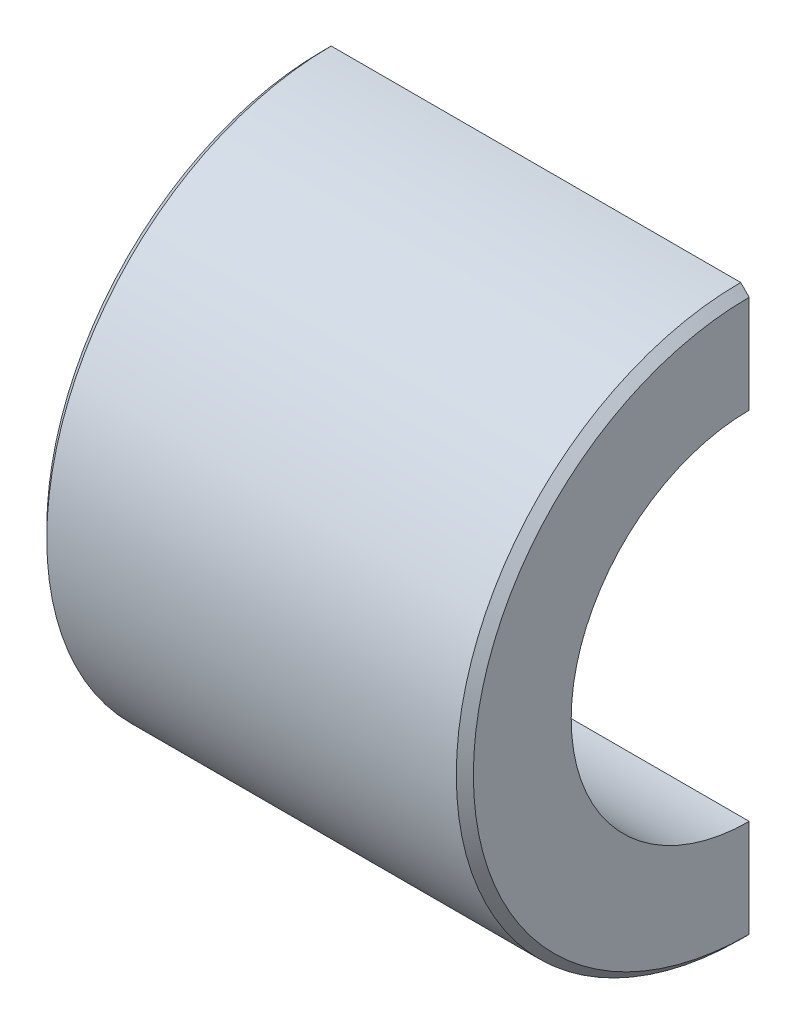
ISO-10303-21;
HEADER;
FILE_DESCRIPTION(('STEP AP214'),'2;1');
FILE_NAME('part.step','',(''),(''),'','','');
FILE_SCHEMA(('AUTOMOTIVE_DESIGN { 1 0 10303 214 1 1 1 1 }'));
ENDSEC;
DATA;
#1=APPLICATION_CONTEXT('core data for automotive mechanical design processes');
#2=APPLICATION_PROTOCOL_DEFINITION('international standard','automotive_design',2000,#1);
#3=PRODUCT_CONTEXT('',#1,'mechanical');
#4=PRODUCT('Part','Part','',(#3));
#5=PRODUCT_RELATED_PRODUCT_CATEGORY('part','',(#4));
#6=PRODUCT_DEFINITION_FORMATION('','',#4);
#7=PRODUCT_DEFINITION_CONTEXT('part definition',#1,'design');
#8=PRODUCT_DEFINITION('design','',#6,#7);
#9=PRODUCT_DEFINITION_SHAPE('','',#8);
#10=(LENGTH_UNIT() NAMED_UNIT(*) SI_UNIT(.MILLI.,.METRE.));
#11=(NAMED_UNIT(*) PLANE_ANGLE_UNIT() SI_UNIT($,.RADIAN.));
#12=(NAMED_UNIT(*) SI_UNIT($,.STERADIAN.) SOLID_ANGLE_UNIT());
#13=UNCERTAINTY_MEASURE_WITH_UNIT(LENGTH_MEASURE(1.E-05),#10,'distance_accuracy_value','');
#14=(GEOMETRIC_REPRESENTATION_CONTEXT(3) GLOBAL_UNCERTAINTY_ASSIGNED_CONTEXT((#13)) GLOBAL_UNIT_ASSIGNED_CONTEXT((#10,
#11,#12)) REPRESENTATION_CONTEXT('',''));
#15=CARTESIAN_POINT('',(0.,0.,0.));
#16=DIRECTION('',(0.,0.,1.));
#17=DIRECTION('',(1.,0.,0.));
#18=AXIS2_PLACEMENT_3D('',#15,#16,#17);
#19=CARTESIAN_POINT('',(19.05,-7.9502,0.));
#20=DIRECTION('',(-1.,0.,0.));
#21=DIRECTION('',(0.,0.,1.));
#22=AXIS2_PLACEMENT_3D('',#19,#20,#21);
#23=PLANE('',#22);
#24=DIRECTION('',(0.,1.,0.));
#25=VECTOR('',#24,1.);
#26=CARTESIAN_POINT('',(19.05,7.9502,0.));
#27=LINE('',#26,#25);
#28=CARTESIAN_POINT('',(19.05,7.9502,0.));
#29=VERTEX_POINT('',#28);
#30=CARTESIAN_POINT('',(19.05,12.319,0.));
#31=VERTEX_POINT('',#30);
#32=EDGE_CURVE('E114',#29,#31,#27,.T.);
#33=ORIENTED_EDGE('',*,*,#32,.T.);
#34=CARTESIAN_POINT('',(19.05,0.,0.));
#35=DIRECTION('',(-1.,0.,0.));
#36=DIRECTION('',(0.,0.,1.));
#37=AXIS2_PLACEMENT_3D('',#34,#35,#36);
#38=CIRCLE('',#37,12.319);
#39=CARTESIAN_POINT('',(19.05,-12.319,0.));
#40=VERTEX_POINT('',#39);
#41=EDGE_CURVE('E11',#31,#40,#38,.F.);
#42=ORIENTED_EDGE('',*,*,#41,.T.);
#43=DIRECTION('',(0.,-1.,0.));
#44=VECTOR('',#43,1.);
#45=CARTESIAN_POINT('',(19.05,-7.9502,0.));
#46=LINE('',#45,#44);
#47=CARTESIAN_POINT('',(19.05,-7.9502,0.));
#48=VERTEX_POINT('',#47);
#49=EDGE_CURVE('E115',#48,#40,#46,.T.);
#50=ORIENTED_EDGE('',*,*,#49,.F.);
#51=CARTESIAN_POINT('',(19.05,0.,0.));
#52=DIRECTION('',(-1.,0.,0.));
#53=DIRECTION('',(0.,0.,1.));
#54=AXIS2_PLACEMENT_3D('',#51,#52,#53);
#55=CIRCLE('',#54,7.9502);
#56=EDGE_CURVE('E111',#48,#29,#55,.T.);
#57=ORIENTED_EDGE('',*,*,#56,.T.);
#58=EDGE_LOOP('',(#33,#42,#50,#57));
#59=FACE_BOUND('',#58,.T.);
#60=ADVANCED_FACE('F36',(#59),#23,.F.);
#61=CARTESIAN_POINT('',(0.,0.,0.));
#62=DIRECTION('',(-1.,0.,0.));
#63=DIRECTION('',(0.,0.,1.));
#64=AXIS2_PLACEMENT_3D('',#61,#62,#63);
#65=CYLINDRICAL_SURFACE('',#64,7.9502);
#66=CARTESIAN_POINT('',(0.,0.,0.));
#67=DIRECTION('',(-1.,0.,0.));
#68=DIRECTION('',(0.,0.,1.));
#69=AXIS2_PLACEMENT_3D('',#66,#67,#68);
#70=CIRCLE('',#69,7.9502);
#71=CARTESIAN_POINT('',(0.,-7.9502,0.));
#72=VERTEX_POINT('',#71);
#73=CARTESIAN_POINT('',(0.,7.9502,0.));
#74=VERTEX_POINT('',#73);
#75=EDGE_CURVE('E96',#72,#74,#70,.T.);
#76=ORIENTED_EDGE('',*,*,#75,.T.);
#77=DIRECTION('',(1.,0.,0.));
#78=VECTOR('',#77,1.);
#79=CARTESIAN_POINT('',(0.,7.9502,0.));
#80=LINE('',#79,#78);
#81=EDGE_CURVE('E102',#74,#29,#80,.T.);
#82=ORIENTED_EDGE('',*,*,#81,.T.);
#83=ORIENTED_EDGE('',*,*,#56,.F.);
#84=DIRECTION('',(1.,0.,0.));
#85=VECTOR('',#84,1.);
#86=CARTESIAN_POINT('',(0.,-7.9502,0.));
#87=LINE('',#86,#85);
#88=EDGE_CURVE('E110',#72,#48,#87,.T.);
#89=ORIENTED_EDGE('',*,*,#88,.F.);
#90=EDGE_LOOP('',(#76,#82,#83,#89));
#91=FACE_BOUND('',#90,.T.);
#92=ADVANCED_FACE('F107',(#91),#65,.F.);
#93=CARTESIAN_POINT('',(0.,-7.9502,0.));
#94=DIRECTION('',(1.,0.,0.));
#95=DIRECTION('',(0.,0.,-1.));
#96=AXIS2_PLACEMENT_3D('',#93,#94,#95);
#97=PLANE('',#96);
#98=DIRECTION('',(0.,1.,0.));
#99=VECTOR('',#98,1.);
#100=CARTESIAN_POINT('',(0.,-7.9502,0.));
#101=LINE('',#100,#99);
#102=CARTESIAN_POINT('',(0.,-12.319,0.));
#103=VERTEX_POINT('',#102);
#104=EDGE_CURVE('E122',#103,#72,#101,.T.);
#105=ORIENTED_EDGE('',*,*,#104,.F.);
#106=CARTESIAN_POINT('',(0.,0.,0.));
#107=DIRECTION('',(1.,0.,0.));
#108=DIRECTION('',(0.,0.,-1.));
#109=AXIS2_PLACEMENT_3D('',#106,#107,#108);
#110=CIRCLE('',#109,12.319);
#111=CARTESIAN_POINT('',(0.,12.319,0.));
#112=VERTEX_POINT('',#111);
#113=EDGE_CURVE('E99',#103,#112,#110,.F.);
#114=ORIENTED_EDGE('',*,*,#113,.T.);
#115=DIRECTION('',(0.,-1.,0.));
#116=VECTOR('',#115,1.);
#117=CARTESIAN_POINT('',(0.,7.9502,0.));
#118=LINE('',#117,#116);
#119=EDGE_CURVE('E92',#112,#74,#118,.T.);
#120=ORIENTED_EDGE('',*,*,#119,.T.);
#121=ORIENTED_EDGE('',*,*,#75,.F.);
#122=EDGE_LOOP('',(#105,#114,#120,#121));
#123=FACE_BOUND('',#122,.T.);
#124=ADVANCED_FACE('F95',(#123),#97,.F.);
#125=CARTESIAN_POINT('',(0.,0.,0.));
#126=DIRECTION('',(-1.,0.,0.));
#127=DIRECTION('',(0.,0.,1.));
#128=AXIS2_PLACEMENT_3D('',#125,#126,#127);
#129=CYLINDRICAL_SURFACE('',#128,12.7);
#130=DIRECTION('',(-1.,0.,0.));
#131=VECTOR('',#130,1.);
#132=CARTESIAN_POINT('',(0.,12.7,0.));
#133=LINE('',#132,#131);
#134=CARTESIAN_POINT('',(18.669,12.7,0.));
#135=VERTEX_POINT('',#134);
#136=CARTESIAN_POINT('',(0.380999999999998,12.7,0.));
#137=VERTEX_POINT('',#136);
#138=EDGE_CURVE('E103',#135,#137,#133,.T.);
#139=ORIENTED_EDGE('',*,*,#138,.T.);
#140=CARTESIAN_POINT('',(0.380999999999998,0.,0.));
#141=DIRECTION('',(1.,0.,0.));
#142=DIRECTION('',(0.,0.,-1.));
#143=AXIS2_PLACEMENT_3D('',#140,#141,#142);
#144=CIRCLE('',#143,12.7);
#145=CARTESIAN_POINT('',(0.380999999999998,-12.7,0.));
#146=VERTEX_POINT('',#145);
#147=EDGE_CURVE('E57',#137,#146,#144,.T.);
#148=ORIENTED_EDGE('',*,*,#147,.T.);
#149=DIRECTION('',(-1.,0.,0.));
#150=VECTOR('',#149,1.);
#151=CARTESIAN_POINT('',(0.,-12.7,0.));
#152=LINE('',#151,#150);
#153=CARTESIAN_POINT('',(18.669,-12.7,0.));
#154=VERTEX_POINT('',#153);
#155=EDGE_CURVE('E117',#154,#146,#152,.T.);
#156=ORIENTED_EDGE('',*,*,#155,.F.);
#157=CARTESIAN_POINT('',(18.669,0.,0.));
#158=DIRECTION('',(-1.,0.,0.));
#159=DIRECTION('',(0.,0.,1.));
#160=AXIS2_PLACEMENT_3D('',#157,#158,#159);
#161=CIRCLE('',#160,12.7);
#162=EDGE_CURVE('E131',#154,#135,#161,.T.);
#163=ORIENTED_EDGE('',*,*,#162,.T.);
#164=EDGE_LOOP('',(#139,#148,#156,#163));
#165=FACE_BOUND('',#164,.T.);
#166=ADVANCED_FACE('F142',(#165),#129,.T.);
#167=CARTESIAN_POINT('',(0.,0.,0.));
#168=DIRECTION('',(0.,0.,1.));
#169=DIRECTION('',(-1.,0.,0.));
#170=AXIS2_PLACEMENT_3D('',#167,#168,#169);
#171=PLANE('',#170);
#172=ORIENTED_EDGE('',*,*,#155,.T.);
#173=DIRECTION('',(0.707106781186549,-0.707106781186546,0.));
#174=VECTOR('',#173,1.);
#175=CARTESIAN_POINT('',(-12.3190000000001,0.,0.));
#176=LINE('',#175,#174);
#177=EDGE_CURVE('E44',#146,#103,#176,.F.);
#178=ORIENTED_EDGE('',*,*,#177,.T.);
#179=ORIENTED_EDGE('',*,*,#104,.T.);
#180=ORIENTED_EDGE('',*,*,#88,.T.);
#181=ORIENTED_EDGE('',*,*,#49,.T.);
#182=DIRECTION('',(0.707106781186552,0.707106781186543,0.));
#183=VECTOR('',#182,1.);
#184=CARTESIAN_POINT('',(31.3690000000002,0.,0.));
#185=LINE('',#184,#183);
#186=EDGE_CURVE('E135',#40,#154,#185,.F.);
#187=ORIENTED_EDGE('',*,*,#186,.T.);
#188=EDGE_LOOP('',(#172,#178,#179,#180,#181,#187));
#189=FACE_BOUND('',#188,.T.);
#190=ADVANCED_FACE('F138',(#189),#171,.F.);
#191=CARTESIAN_POINT('',(0.,0.,0.));
#192=DIRECTION('',(0.,0.,-1.));
#193=DIRECTION('',(-1.,0.,0.));
#194=AXIS2_PLACEMENT_3D('',#191,#192,#193);
#195=PLANE('',#194);
#196=ORIENTED_EDGE('',*,*,#119,.F.);
#197=DIRECTION('',(0.707106781186549,0.707106781186546,0.));
#198=VECTOR('',#197,1.);
#199=CARTESIAN_POINT('',(-12.3190000000001,0.,0.));
#200=LINE('',#199,#198);
#201=EDGE_CURVE('E129',#112,#137,#200,.T.);
#202=ORIENTED_EDGE('',*,*,#201,.T.);
#203=ORIENTED_EDGE('',*,*,#138,.F.);
#204=DIRECTION('',(0.707106781186552,-0.707106781186543,0.));
#205=VECTOR('',#204,1.);
#206=CARTESIAN_POINT('',(31.3690000000002,0.,0.));
#207=LINE('',#206,#205);
#208=EDGE_CURVE('E127',#135,#31,#207,.T.);
#209=ORIENTED_EDGE('',*,*,#208,.T.);
#210=ORIENTED_EDGE('',*,*,#32,.F.);
#211=ORIENTED_EDGE('',*,*,#81,.F.);
#212=EDGE_LOOP('',(#196,#202,#203,#209,#210,#211));
#213=FACE_BOUND('',#212,.T.);
#214=ADVANCED_FACE('F113',(#213),#195,.T.);
#215=CARTESIAN_POINT('',(0.,0.,0.));
#216=DIRECTION('',(1.,0.,0.));
#217=DIRECTION('',(0.,0.,-1.));
#218=AXIS2_PLACEMENT_3D('',#215,#216,#217);
#219=CONICAL_SURFACE('',#218,12.319,0.785398163397446);
#220=ORIENTED_EDGE('',*,*,#177,.F.);
#221=ORIENTED_EDGE('',*,*,#147,.F.);
#222=ORIENTED_EDGE('',*,*,#201,.F.);
#223=ORIENTED_EDGE('',*,*,#113,.F.);
#224=EDGE_LOOP('',(#220,#221,#222,#223));
#225=FACE_BOUND('',#224,.T.);
#226=ADVANCED_FACE('F140',(#225),#219,.T.);
#227=CARTESIAN_POINT('',(18.669,0.,0.));
#228=DIRECTION('',(-1.,0.,0.));
#229=DIRECTION('',(0.,0.,1.));
#230=AXIS2_PLACEMENT_3D('',#227,#228,#229);
#231=CONICAL_SURFACE('',#230,12.7,0.785398163397442);
#232=ORIENTED_EDGE('',*,*,#186,.F.);
#233=ORIENTED_EDGE('',*,*,#41,.F.);
#234=ORIENTED_EDGE('',*,*,#208,.F.);
#235=ORIENTED_EDGE('',*,*,#162,.F.);
#236=EDGE_LOOP('',(#232,#233,#234,#235));
#237=FACE_BOUND('',#236,.T.);
#238=ADVANCED_FACE('F38',(#237),#231,.T.);
#239=CLOSED_SHELL('',(#60,#92,#124,#166,#190,#214,#226,#238));
#240=MANIFOLD_SOLID_BREP('B2',#239);
#241=ADVANCED_BREP_SHAPE_REPRESENTATION('',(#18,#240),#14);
#242=SHAPE_DEFINITION_REPRESENTATION(#9,#241);
ENDSEC;
END-ISO-10303-21;
